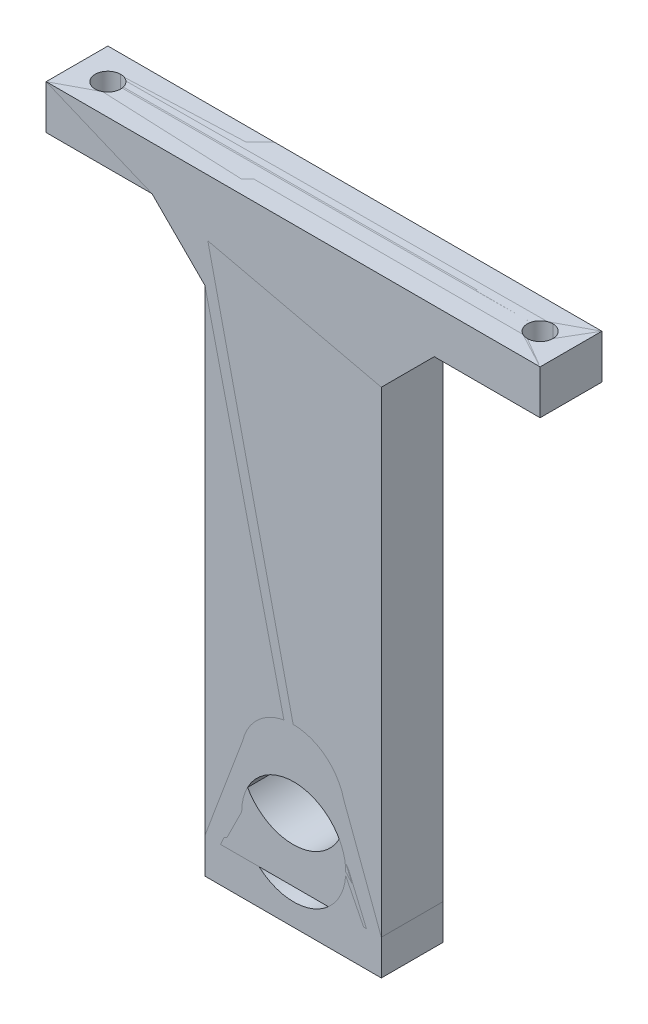
ISO-10303-21;
HEADER;
FILE_DESCRIPTION(('STEP AP214'),'2;1');
FILE_NAME('part.step','',(''),(''),'','','');
FILE_SCHEMA(('AUTOMOTIVE_DESIGN { 1 0 10303 214 1 1 1 1 }'));
ENDSEC;
DATA;
#1=APPLICATION_CONTEXT('core data for automotive mechanical design processes');
#2=APPLICATION_PROTOCOL_DEFINITION('international standard','automotive_design',2000,#1);
#3=PRODUCT_CONTEXT('',#1,'mechanical');
#4=PRODUCT('Part','Part','',(#3));
#5=PRODUCT_RELATED_PRODUCT_CATEGORY('part','',(#4));
#6=PRODUCT_DEFINITION_FORMATION('','',#4);
#7=PRODUCT_DEFINITION_CONTEXT('part definition',#1,'design');
#8=PRODUCT_DEFINITION('design','',#6,#7);
#9=PRODUCT_DEFINITION_SHAPE('','',#8);
#10=(LENGTH_UNIT() NAMED_UNIT(*) SI_UNIT(.MILLI.,.METRE.));
#11=(NAMED_UNIT(*) PLANE_ANGLE_UNIT() SI_UNIT($,.RADIAN.));
#12=(NAMED_UNIT(*) SI_UNIT($,.STERADIAN.) SOLID_ANGLE_UNIT());
#13=UNCERTAINTY_MEASURE_WITH_UNIT(LENGTH_MEASURE(1.E-05),#10,'distance_accuracy_value','');
#14=(GEOMETRIC_REPRESENTATION_CONTEXT(3) GLOBAL_UNCERTAINTY_ASSIGNED_CONTEXT((#13)) GLOBAL_UNIT_ASSIGNED_CONTEXT((#10,
#11,#12)) REPRESENTATION_CONTEXT('',''));
#15=CARTESIAN_POINT('',(0.,0.,0.));
#16=DIRECTION('',(0.,0.,1.));
#17=DIRECTION('',(1.,0.,0.));
#18=AXIS2_PLACEMENT_3D('',#15,#16,#17);
#19=CARTESIAN_POINT('',(10.,0.,24.));
#20=DIRECTION('',(1.,0.,0.));
#21=DIRECTION('',(0.,1.,0.));
#22=AXIS2_PLACEMENT_3D('',#19,#20,#21);
#23=PLANE('',#22);
#24=DIRECTION('',(0.,-1.,0.));
#25=VECTOR('',#24,1.);
#26=CARTESIAN_POINT('',(10.,-5.,24.));
#27=LINE('',#26,#25);
#28=CARTESIAN_POINT('',(10.,-11.,24.));
#29=VERTEX_POINT('',#28);
#30=CARTESIAN_POINT('',(10.,-69.,24.));
#31=VERTEX_POINT('',#30);
#32=EDGE_CURVE('P0_E223',#29,#31,#27,.T.);
#33=ORIENTED_EDGE('',*,*,#32,.F.);
#34=DIRECTION('',(0.,0.,1.));
#35=VECTOR('',#34,1.);
#36=CARTESIAN_POINT('',(10.,-11.,24.));
#37=LINE('',#36,#35);
#38=CARTESIAN_POINT('',(10.,-11.,31.));
#39=VERTEX_POINT('',#38);
#40=EDGE_CURVE('P0_E143',#29,#39,#37,.T.);
#41=ORIENTED_EDGE('',*,*,#40,.T.);
#42=DIRECTION('',(0.,-1.,0.));
#43=VECTOR('',#42,1.);
#44=CARTESIAN_POINT('',(10.,-5.,31.));
#45=LINE('',#44,#43);
#46=CARTESIAN_POINT('',(10.,-69.,31.));
#47=VERTEX_POINT('',#46);
#48=EDGE_CURVE('P0_E137',#39,#47,#45,.T.);
#49=ORIENTED_EDGE('',*,*,#48,.T.);
#50=DIRECTION('',(0.,0.,1.));
#51=VECTOR('',#50,1.);
#52=CARTESIAN_POINT('',(10.,-69.,24.));
#53=LINE('',#52,#51);
#54=EDGE_CURVE('P0_E141',#31,#47,#53,.T.);
#55=ORIENTED_EDGE('',*,*,#54,.F.);
#56=EDGE_LOOP('',(#33,#41,#49,#55));
#57=FACE_BOUND('',#56,.T.);
#58=ADVANCED_FACE('P0_F36',(#57),#23,.T.);
#59=CARTESIAN_POINT('',(0.,-5.,0.));
#60=DIRECTION('',(0.,1.,0.));
#61=DIRECTION('',(1.,0.,0.));
#62=AXIS2_PLACEMENT_3D('',#59,#60,#61);
#63=PLANE('',#62);
#64=DIRECTION('',(1.,0.,0.));
#65=VECTOR('',#64,1.);
#66=CARTESIAN_POINT('',(10.,-5.,31.));
#67=LINE('',#66,#65);
#68=CARTESIAN_POINT('',(16.,-5.,31.));
#69=VERTEX_POINT('',#68);
#70=CARTESIAN_POINT('',(28.,-5.,31.));
#71=VERTEX_POINT('',#70);
#72=EDGE_CURVE('P0_E190',#69,#71,#67,.T.);
#73=ORIENTED_EDGE('',*,*,#72,.F.);
#74=DIRECTION('',(0.,0.,-1.));
#75=VECTOR('',#74,1.);
#76=CARTESIAN_POINT('',(16.,-5.,0.));
#77=LINE('',#76,#75);
#78=CARTESIAN_POINT('',(16.,-5.,24.));
#79=VERTEX_POINT('',#78);
#80=EDGE_CURVE('P0_E58',#69,#79,#77,.T.);
#81=ORIENTED_EDGE('',*,*,#80,.T.);
#82=DIRECTION('',(-1.,0.,0.));
#83=VECTOR('',#82,1.);
#84=CARTESIAN_POINT('',(28.,-5.,24.));
#85=LINE('',#84,#83);
#86=CARTESIAN_POINT('',(28.,-5.,24.));
#87=VERTEX_POINT('',#86);
#88=EDGE_CURVE('P0_E200',#87,#79,#85,.T.);
#89=ORIENTED_EDGE('',*,*,#88,.F.);
#90=DIRECTION('',(0.,0.,-1.));
#91=VECTOR('',#90,1.);
#92=CARTESIAN_POINT('',(28.,-5.,31.));
#93=LINE('',#92,#91);
#94=EDGE_CURVE('P0_E221',#71,#87,#93,.T.);
#95=ORIENTED_EDGE('',*,*,#94,.F.);
#96=EDGE_LOOP('',(#73,#81,#89,#95));
#97=FACE_BOUND('',#96,.T.);
#98=CARTESIAN_POINT('',(24.5,-5.,27.5));
#99=DIRECTION('',(0.,-1.,0.));
#100=DIRECTION('',(0.,0.,1.));
#101=AXIS2_PLACEMENT_3D('',#98,#99,#100);
#102=CIRCLE('',#101,1.45);
#103=CARTESIAN_POINT('',(24.5,-5.,28.95));
#104=VERTEX_POINT('',#103);
#105=CARTESIAN_POINT('',(24.5,-5.,26.05));
#106=VERTEX_POINT('',#105);
#107=EDGE_CURVE('P0_E172',#104,#106,#102,.T.);
#108=ORIENTED_EDGE('',*,*,#107,.F.);
#109=CARTESIAN_POINT('',(24.5,-5.,27.5));
#110=DIRECTION('',(0.,-1.,0.));
#111=DIRECTION('',(0.,0.,-1.));
#112=AXIS2_PLACEMENT_3D('',#109,#110,#111);
#113=CIRCLE('',#112,1.45);
#114=EDGE_CURVE('P0_E196',#106,#104,#113,.T.);
#115=ORIENTED_EDGE('',*,*,#114,.F.);
#116=EDGE_LOOP('',(#108,#115));
#117=FACE_BOUND('',#116,.T.);
#118=ADVANCED_FACE('P0_F281',(#97,#117),#63,.F.);
#119=CARTESIAN_POINT('',(0.,-5.,0.));
#120=DIRECTION('',(0.,1.,0.));
#121=DIRECTION('',(1.,0.,0.));
#122=AXIS2_PLACEMENT_3D('',#119,#120,#121);
#123=PLANE('',#122);
#124=DIRECTION('',(-1.,0.,0.));
#125=VECTOR('',#124,1.);
#126=CARTESIAN_POINT('',(-10.,-5.,24.));
#127=LINE('',#126,#125);
#128=CARTESIAN_POINT('',(-16.,-5.,24.));
#129=VERTEX_POINT('',#128);
#130=CARTESIAN_POINT('',(-28.,-5.,24.));
#131=VERTEX_POINT('',#130);
#132=EDGE_CURVE('P0_E192',#129,#131,#127,.T.);
#133=ORIENTED_EDGE('',*,*,#132,.F.);
#134=DIRECTION('',(0.,0.,1.));
#135=VECTOR('',#134,1.);
#136=CARTESIAN_POINT('',(-16.,-5.,0.));
#137=LINE('',#136,#135);
#138=CARTESIAN_POINT('',(-16.,-5.,31.));
#139=VERTEX_POINT('',#138);
#140=EDGE_CURVE('P0_E244',#129,#139,#137,.T.);
#141=ORIENTED_EDGE('',*,*,#140,.T.);
#142=DIRECTION('',(1.,0.,0.));
#143=VECTOR('',#142,1.);
#144=CARTESIAN_POINT('',(-28.,-5.,31.));
#145=LINE('',#144,#143);
#146=CARTESIAN_POINT('',(-28.,-5.,31.));
#147=VERTEX_POINT('',#146);
#148=EDGE_CURVE('P0_E203',#147,#139,#145,.T.);
#149=ORIENTED_EDGE('',*,*,#148,.F.);
#150=DIRECTION('',(0.,0.,1.));
#151=VECTOR('',#150,1.);
#152=CARTESIAN_POINT('',(-28.,-5.,24.));
#153=LINE('',#152,#151);
#154=EDGE_CURVE('P0_E182',#131,#147,#153,.T.);
#155=ORIENTED_EDGE('',*,*,#154,.F.);
#156=EDGE_LOOP('',(#133,#141,#149,#155));
#157=FACE_BOUND('',#156,.T.);
#158=CARTESIAN_POINT('',(-24.5,-5.,27.5));
#159=DIRECTION('',(0.,-1.,0.));
#160=DIRECTION('',(0.,0.,1.));
#161=AXIS2_PLACEMENT_3D('',#158,#159,#160);
#162=CIRCLE('',#161,1.45);
#163=CARTESIAN_POINT('',(-24.5,-5.,28.95));
#164=VERTEX_POINT('',#163);
#165=CARTESIAN_POINT('',(-24.5,-5.,26.05));
#166=VERTEX_POINT('',#165);
#167=EDGE_CURVE('P0_E207',#164,#166,#162,.T.);
#168=ORIENTED_EDGE('',*,*,#167,.F.);
#169=CARTESIAN_POINT('',(-24.5,-5.,27.5));
#170=DIRECTION('',(0.,-1.,0.));
#171=DIRECTION('',(0.,0.,-1.));
#172=AXIS2_PLACEMENT_3D('',#169,#170,#171);
#173=CIRCLE('',#172,1.45);
#174=EDGE_CURVE('P0_E212',#166,#164,#173,.T.);
#175=ORIENTED_EDGE('',*,*,#174,.F.);
#176=EDGE_LOOP('',(#168,#175));
#177=FACE_BOUND('',#176,.T.);
#178=ADVANCED_FACE('P0_F266',(#157,#177),#123,.F.);
#179=CARTESIAN_POINT('',(-24.5,0.,27.5));
#180=DIRECTION('',(0.,1.,0.));
#181=DIRECTION('',(0.,0.,-1.));
#182=AXIS2_PLACEMENT_3D('',#179,#180,#181);
#183=CYLINDRICAL_SURFACE('',#182,1.45);
#184=DIRECTION('',(0.,-1.,0.));
#185=VECTOR('',#184,1.);
#186=CARTESIAN_POINT('',(-24.5,0.,26.05));
#187=LINE('',#186,#185);
#188=CARTESIAN_POINT('',(-24.5,0.,26.05));
#189=VERTEX_POINT('',#188);
#190=EDGE_CURVE('P0_E145',#189,#166,#187,.T.);
#191=ORIENTED_EDGE('',*,*,#190,.T.);
#192=ORIENTED_EDGE('',*,*,#174,.T.);
#193=DIRECTION('',(0.,-1.,0.));
#194=VECTOR('',#193,1.);
#195=CARTESIAN_POINT('',(-24.5,0.,28.95));
#196=LINE('',#195,#194);
#197=CARTESIAN_POINT('',(-24.5,0.,28.95));
#198=VERTEX_POINT('',#197);
#199=EDGE_CURVE('P0_E187',#198,#164,#196,.T.);
#200=ORIENTED_EDGE('',*,*,#199,.F.);
#201=CARTESIAN_POINT('',(-24.5,0.,27.5));
#202=DIRECTION('',(0.,-1.,0.));
#203=DIRECTION('',(0.,0.,-1.));
#204=AXIS2_PLACEMENT_3D('',#201,#202,#203);
#205=CIRCLE('',#204,1.45);
#206=EDGE_CURVE('P0_E183',#189,#198,#205,.T.);
#207=ORIENTED_EDGE('',*,*,#206,.F.);
#208=EDGE_LOOP('',(#191,#192,#200,#207));
#209=FACE_BOUND('',#208,.T.);
#210=ADVANCED_FACE('P0_F325',(#209),#183,.F.);
#211=CARTESIAN_POINT('',(0.,0.,0.));
#212=DIRECTION('',(0.,1.,0.));
#213=DIRECTION('',(1.,0.,0.));
#214=AXIS2_PLACEMENT_3D('',#211,#212,#213);
#215=PLANE('',#214);
#216=DIRECTION('',(1.,0.,0.));
#217=VECTOR('',#216,1.);
#218=CARTESIAN_POINT('',(-28.,0.,31.));
#219=LINE('',#218,#217);
#220=CARTESIAN_POINT('',(-28.,0.,31.));
#221=VERTEX_POINT('',#220);
#222=CARTESIAN_POINT('',(28.,0.,31.));
#223=VERTEX_POINT('',#222);
#224=EDGE_CURVE('P0_E179',#221,#223,#219,.T.);
#225=ORIENTED_EDGE('',*,*,#224,.T.);
#226=DIRECTION('',(0.,0.,-1.));
#227=VECTOR('',#226,1.);
#228=CARTESIAN_POINT('',(28.,0.,31.));
#229=LINE('',#228,#227);
#230=CARTESIAN_POINT('',(28.,0.,24.));
#231=VERTEX_POINT('',#230);
#232=EDGE_CURVE('P0_E209',#223,#231,#229,.T.);
#233=ORIENTED_EDGE('',*,*,#232,.T.);
#234=DIRECTION('',(-1.,0.,0.));
#235=VECTOR('',#234,1.);
#236=CARTESIAN_POINT('',(28.,0.,24.));
#237=LINE('',#236,#235);
#238=CARTESIAN_POINT('',(-28.,0.,24.));
#239=VERTEX_POINT('',#238);
#240=EDGE_CURVE('P0_E213',#231,#239,#237,.T.);
#241=ORIENTED_EDGE('',*,*,#240,.T.);
#242=DIRECTION('',(0.,0.,1.));
#243=VECTOR('',#242,1.);
#244=CARTESIAN_POINT('',(-28.,0.,24.));
#245=LINE('',#244,#243);
#246=EDGE_CURVE('P0_E228',#239,#221,#245,.T.);
#247=ORIENTED_EDGE('',*,*,#246,.T.);
#248=EDGE_LOOP('',(#225,#233,#241,#247));
#249=FACE_BOUND('',#248,.T.);
#250=CARTESIAN_POINT('',(-24.5,0.,27.5));
#251=DIRECTION('',(0.,-1.,0.));
#252=DIRECTION('',(0.,0.,1.));
#253=AXIS2_PLACEMENT_3D('',#250,#251,#252);
#254=CIRCLE('',#253,1.45);
#255=EDGE_CURVE('P0_E186',#198,#189,#254,.T.);
#256=ORIENTED_EDGE('',*,*,#255,.T.);
#257=ORIENTED_EDGE('',*,*,#206,.T.);
#258=EDGE_LOOP('',(#256,#257));
#259=FACE_BOUND('',#258,.T.);
#260=CARTESIAN_POINT('',(24.5,0.,27.5));
#261=DIRECTION('',(0.,-1.,0.));
#262=DIRECTION('',(0.,0.,1.));
#263=AXIS2_PLACEMENT_3D('',#260,#261,#262);
#264=CIRCLE('',#263,1.45);
#265=CARTESIAN_POINT('',(24.5,0.,28.95));
#266=VERTEX_POINT('',#265);
#267=CARTESIAN_POINT('',(24.5,0.,26.05));
#268=VERTEX_POINT('',#267);
#269=EDGE_CURVE('P0_E176',#266,#268,#264,.T.);
#270=ORIENTED_EDGE('',*,*,#269,.T.);
#271=CARTESIAN_POINT('',(24.5,0.,27.5));
#272=DIRECTION('',(0.,-1.,0.));
#273=DIRECTION('',(0.,0.,-1.));
#274=AXIS2_PLACEMENT_3D('',#271,#272,#273);
#275=CIRCLE('',#274,1.45);
#276=EDGE_CURVE('P0_E180',#268,#266,#275,.T.);
#277=ORIENTED_EDGE('',*,*,#276,.T.);
#278=EDGE_LOOP('',(#270,#277));
#279=FACE_BOUND('',#278,.T.);
#280=ADVANCED_FACE('P0_F275',(#249,#259,#279),#215,.T.);
#281=CARTESIAN_POINT('',(-24.5,0.,27.5));
#282=DIRECTION('',(0.,1.,0.));
#283=DIRECTION('',(0.,0.,-1.));
#284=AXIS2_PLACEMENT_3D('',#281,#282,#283);
#285=CYLINDRICAL_SURFACE('',#284,1.45);
#286=ORIENTED_EDGE('',*,*,#199,.T.);
#287=ORIENTED_EDGE('',*,*,#167,.T.);
#288=ORIENTED_EDGE('',*,*,#190,.F.);
#289=ORIENTED_EDGE('',*,*,#255,.F.);
#290=EDGE_LOOP('',(#286,#287,#288,#289));
#291=FACE_BOUND('',#290,.T.);
#292=ADVANCED_FACE('P0_F304',(#291),#285,.F.);
#293=CARTESIAN_POINT('',(24.5,0.,27.5));
#294=DIRECTION('',(0.,1.,0.));
#295=DIRECTION('',(0.,0.,-1.));
#296=AXIS2_PLACEMENT_3D('',#293,#294,#295);
#297=CYLINDRICAL_SURFACE('',#296,1.45);
#298=DIRECTION('',(0.,-1.,0.));
#299=VECTOR('',#298,1.);
#300=CARTESIAN_POINT('',(24.5,0.,26.05));
#301=LINE('',#300,#299);
#302=EDGE_CURVE('P0_E204',#268,#106,#301,.T.);
#303=ORIENTED_EDGE('',*,*,#302,.T.);
#304=ORIENTED_EDGE('',*,*,#114,.T.);
#305=DIRECTION('',(0.,-1.,0.));
#306=VECTOR('',#305,1.);
#307=CARTESIAN_POINT('',(24.5,0.,28.95));
#308=LINE('',#307,#306);
#309=EDGE_CURVE('P0_E174',#266,#104,#308,.T.);
#310=ORIENTED_EDGE('',*,*,#309,.F.);
#311=ORIENTED_EDGE('',*,*,#276,.F.);
#312=EDGE_LOOP('',(#303,#304,#310,#311));
#313=FACE_BOUND('',#312,.T.);
#314=ADVANCED_FACE('P0_F301',(#313),#297,.F.);
#315=CARTESIAN_POINT('',(24.5,0.,27.5));
#316=DIRECTION('',(0.,1.,0.));
#317=DIRECTION('',(0.,0.,-1.));
#318=AXIS2_PLACEMENT_3D('',#315,#316,#317);
#319=CYLINDRICAL_SURFACE('',#318,1.45);
#320=ORIENTED_EDGE('',*,*,#309,.T.);
#321=ORIENTED_EDGE('',*,*,#107,.T.);
#322=ORIENTED_EDGE('',*,*,#302,.F.);
#323=ORIENTED_EDGE('',*,*,#269,.F.);
#324=EDGE_LOOP('',(#320,#321,#322,#323));
#325=FACE_BOUND('',#324,.T.);
#326=ADVANCED_FACE('P0_F303',(#325),#319,.F.);
#327=CARTESIAN_POINT('',(10.,0.,31.));
#328=DIRECTION('',(0.,0.,1.));
#329=DIRECTION('',(1.,0.,0.));
#330=AXIS2_PLACEMENT_3D('',#327,#328,#329);
#331=PLANE('',#330);
#332=CARTESIAN_POINT('',(0.0675761844499759,-60.6,31.));
#333=DIRECTION('',(0.,0.,-1.));
#334=DIRECTION('',(-1.,0.,0.));
#335=AXIS2_PLACEMENT_3D('',#332,#333,#334);
#336=CIRCLE('',#335,5.9);
#337=CARTESIAN_POINT('',(-5.83242381555003,-60.6,31.));
#338=VERTEX_POINT('',#337);
#339=EDGE_CURVE('P0_E162',#338,#338,#336,.T.);
#340=ORIENTED_EDGE('',*,*,#339,.T.);
#341=EDGE_LOOP('',(#340));
#342=FACE_BOUND('',#341,.T.);
#343=ORIENTED_EDGE('',*,*,#148,.T.);
#344=DIRECTION('',(0.707106781186544,-0.707106781186551,0.));
#345=VECTOR('',#344,1.);
#346=CARTESIAN_POINT('',(-10.,-11.,31.));
#347=LINE('',#346,#345);
#348=CARTESIAN_POINT('',(-10.,-11.,31.));
#349=VERTEX_POINT('',#348);
#350=EDGE_CURVE('P0_E250',#139,#349,#347,.T.);
#351=ORIENTED_EDGE('',*,*,#350,.T.);
#352=DIRECTION('',(0.,-1.,0.));
#353=VECTOR('',#352,1.);
#354=CARTESIAN_POINT('',(-10.,-5.,31.));
#355=LINE('',#354,#353);
#356=CARTESIAN_POINT('',(-10.,-69.,31.));
#357=VERTEX_POINT('',#356);
#358=EDGE_CURVE('P0_E152',#349,#357,#355,.T.);
#359=ORIENTED_EDGE('',*,*,#358,.T.);
#360=DIRECTION('',(-1.,0.,0.));
#361=VECTOR('',#360,1.);
#362=CARTESIAN_POINT('',(10.,-69.,31.));
#363=LINE('',#362,#361);
#364=EDGE_CURVE('P0_E148',#47,#357,#363,.T.);
#365=ORIENTED_EDGE('',*,*,#364,.F.);
#366=ORIENTED_EDGE('',*,*,#48,.F.);
#367=DIRECTION('',(0.707106781186544,0.707106781186551,0.));
#368=VECTOR('',#367,1.);
#369=CARTESIAN_POINT('',(10.,-11.,31.));
#370=LINE('',#369,#368);
#371=EDGE_CURVE('P0_E45',#39,#69,#370,.T.);
#372=ORIENTED_EDGE('',*,*,#371,.T.);
#373=ORIENTED_EDGE('',*,*,#72,.T.);
#374=DIRECTION('',(0.,-1.,0.));
#375=VECTOR('',#374,1.);
#376=CARTESIAN_POINT('',(28.,0.,31.));
#377=LINE('',#376,#375);
#378=EDGE_CURVE('P0_E225',#223,#71,#377,.T.);
#379=ORIENTED_EDGE('',*,*,#378,.F.);
#380=ORIENTED_EDGE('',*,*,#224,.F.);
#381=DIRECTION('',(0.,-1.,0.));
#382=VECTOR('',#381,1.);
#383=CARTESIAN_POINT('',(-28.,0.,31.));
#384=LINE('',#383,#382);
#385=EDGE_CURVE('P0_E175',#221,#147,#384,.T.);
#386=ORIENTED_EDGE('',*,*,#385,.T.);
#387=EDGE_LOOP('',(#343,#351,#359,#365,#366,#372,#373,#379,#380,#386));
#388=FACE_BOUND('',#387,.T.);
#389=ADVANCED_FACE('P0_F150',(#342,#388),#331,.T.);
#390=CARTESIAN_POINT('',(-10.,0.,24.));
#391=DIRECTION('',(0.,0.,-1.));
#392=DIRECTION('',(0.,-1.,0.));
#393=AXIS2_PLACEMENT_3D('',#390,#391,#392);
#394=PLANE('',#393);
#395=CARTESIAN_POINT('',(0.0675761844499759,-60.6,24.));
#396=DIRECTION('',(0.,0.,-1.));
#397=DIRECTION('',(-1.,0.,0.));
#398=AXIS2_PLACEMENT_3D('',#395,#396,#397);
#399=CIRCLE('',#398,5.9);
#400=CARTESIAN_POINT('',(-5.83242381555003,-60.6,24.));
#401=VERTEX_POINT('',#400);
#402=EDGE_CURVE('P0_E165',#401,#401,#399,.T.);
#403=ORIENTED_EDGE('',*,*,#402,.F.);
#404=EDGE_LOOP('',(#403));
#405=FACE_BOUND('',#404,.T.);
#406=DIRECTION('',(0.,-1.,0.));
#407=VECTOR('',#406,1.);
#408=CARTESIAN_POINT('',(-28.,0.,24.));
#409=LINE('',#408,#407);
#410=EDGE_CURVE('P0_E216',#239,#131,#409,.T.);
#411=ORIENTED_EDGE('',*,*,#410,.F.);
#412=ORIENTED_EDGE('',*,*,#240,.F.);
#413=DIRECTION('',(0.,-1.,0.));
#414=VECTOR('',#413,1.);
#415=CARTESIAN_POINT('',(28.,0.,24.));
#416=LINE('',#415,#414);
#417=EDGE_CURVE('P0_E197',#231,#87,#416,.T.);
#418=ORIENTED_EDGE('',*,*,#417,.T.);
#419=ORIENTED_EDGE('',*,*,#88,.T.);
#420=DIRECTION('',(-0.707106781186544,-0.707106781186551,0.));
#421=VECTOR('',#420,1.);
#422=CARTESIAN_POINT('',(10.,-11.,24.));
#423=LINE('',#422,#421);
#424=EDGE_CURVE('P0_E11',#79,#29,#423,.T.);
#425=ORIENTED_EDGE('',*,*,#424,.T.);
#426=ORIENTED_EDGE('',*,*,#32,.T.);
#427=DIRECTION('',(1.,0.,0.));
#428=VECTOR('',#427,1.);
#429=CARTESIAN_POINT('',(-10.,-69.,24.));
#430=LINE('',#429,#428);
#431=CARTESIAN_POINT('',(-10.,-69.,24.));
#432=VERTEX_POINT('',#431);
#433=EDGE_CURVE('P0_E161',#432,#31,#430,.T.);
#434=ORIENTED_EDGE('',*,*,#433,.F.);
#435=DIRECTION('',(0.,-1.,0.));
#436=VECTOR('',#435,1.);
#437=CARTESIAN_POINT('',(-10.,-5.,24.));
#438=LINE('',#437,#436);
#439=CARTESIAN_POINT('',(-10.,-11.,24.));
#440=VERTEX_POINT('',#439);
#441=EDGE_CURVE('P0_E171',#440,#432,#438,.T.);
#442=ORIENTED_EDGE('',*,*,#441,.F.);
#443=DIRECTION('',(-0.707106781186544,0.707106781186551,0.));
#444=VECTOR('',#443,1.);
#445=CARTESIAN_POINT('',(-10.,-11.,24.));
#446=LINE('',#445,#444);
#447=EDGE_CURVE('P0_E248',#440,#129,#446,.T.);
#448=ORIENTED_EDGE('',*,*,#447,.T.);
#449=ORIENTED_EDGE('',*,*,#132,.T.);
#450=EDGE_LOOP('',(#411,#412,#418,#419,#425,#426,#434,#442,#448,#449));
#451=FACE_BOUND('',#450,.T.);
#452=ADVANCED_FACE('P0_F263',(#405,#451),#394,.T.);
#453=CARTESIAN_POINT('',(28.,0.,31.));
#454=DIRECTION('',(1.,0.,0.));
#455=DIRECTION('',(0.,1.,0.));
#456=AXIS2_PLACEMENT_3D('',#453,#454,#455);
#457=PLANE('',#456);
#458=ORIENTED_EDGE('',*,*,#378,.T.);
#459=ORIENTED_EDGE('',*,*,#94,.T.);
#460=ORIENTED_EDGE('',*,*,#417,.F.);
#461=ORIENTED_EDGE('',*,*,#232,.F.);
#462=EDGE_LOOP('',(#458,#459,#460,#461));
#463=FACE_BOUND('',#462,.T.);
#464=ADVANCED_FACE('P0_F279',(#463),#457,.T.);
#465=CARTESIAN_POINT('',(-28.,0.,24.));
#466=DIRECTION('',(-1.,0.,0.));
#467=DIRECTION('',(0.,0.,1.));
#468=AXIS2_PLACEMENT_3D('',#465,#466,#467);
#469=PLANE('',#468);
#470=ORIENTED_EDGE('',*,*,#410,.T.);
#471=ORIENTED_EDGE('',*,*,#154,.T.);
#472=ORIENTED_EDGE('',*,*,#385,.F.);
#473=ORIENTED_EDGE('',*,*,#246,.F.);
#474=EDGE_LOOP('',(#470,#471,#472,#473));
#475=FACE_BOUND('',#474,.T.);
#476=ADVANCED_FACE('P0_F271',(#475),#469,.T.);
#477=CARTESIAN_POINT('',(-10.,0.,31.));
#478=DIRECTION('',(-1.,0.,0.));
#479=DIRECTION('',(0.,0.,1.));
#480=AXIS2_PLACEMENT_3D('',#477,#478,#479);
#481=PLANE('',#480);
#482=ORIENTED_EDGE('',*,*,#358,.F.);
#483=DIRECTION('',(0.,0.,-1.));
#484=VECTOR('',#483,1.);
#485=CARTESIAN_POINT('',(-10.,-11.,31.));
#486=LINE('',#485,#484);
#487=EDGE_CURVE('P0_E144',#349,#440,#486,.T.);
#488=ORIENTED_EDGE('',*,*,#487,.T.);
#489=ORIENTED_EDGE('',*,*,#441,.T.);
#490=DIRECTION('',(0.,0.,-1.));
#491=VECTOR('',#490,1.);
#492=CARTESIAN_POINT('',(-10.,-69.,31.));
#493=LINE('',#492,#491);
#494=EDGE_CURVE('P0_E156',#357,#432,#493,.T.);
#495=ORIENTED_EDGE('',*,*,#494,.F.);
#496=EDGE_LOOP('',(#482,#488,#489,#495));
#497=FACE_BOUND('',#496,.T.);
#498=ADVANCED_FACE('P0_F257',(#497),#481,.T.);
#499=CARTESIAN_POINT('',(0.,-69.,0.));
#500=DIRECTION('',(0.,-1.,0.));
#501=DIRECTION('',(0.,0.,-1.));
#502=AXIS2_PLACEMENT_3D('',#499,#500,#501);
#503=PLANE('',#502);
#504=ORIENTED_EDGE('',*,*,#54,.T.);
#505=ORIENTED_EDGE('',*,*,#364,.T.);
#506=ORIENTED_EDGE('',*,*,#494,.T.);
#507=ORIENTED_EDGE('',*,*,#433,.T.);
#508=EDGE_LOOP('',(#504,#505,#506,#507));
#509=FACE_BOUND('',#508,.T.);
#510=ADVANCED_FACE('P0_F159',(#509),#503,.T.);
#511=CARTESIAN_POINT('',(0.0675761844499759,-60.6,31.));
#512=DIRECTION('',(0.,0.,-1.));
#513=DIRECTION('',(-1.,0.,0.));
#514=AXIS2_PLACEMENT_3D('',#511,#512,#513);
#515=CYLINDRICAL_SURFACE('',#514,5.9);
#516=CARTESIAN_POINT('',(-5.83242381555003,-60.6,31.));
#517=CARTESIAN_POINT('',(-5.83242381555003,-60.6,30.9270833333333));
#518=CARTESIAN_POINT('',(-5.83242381555003,-60.6,30.8541666666667));
#519=CARTESIAN_POINT('',(-5.83242381555003,-60.6,30.7083333333333));
#520=CARTESIAN_POINT('',(-5.83242381555003,-60.6,30.6354166666667));
#521=CARTESIAN_POINT('',(-5.83242381555003,-60.6,30.4895833333333));
#522=CARTESIAN_POINT('',(-5.83242381555003,-60.6,30.4166666666667));
#523=CARTESIAN_POINT('',(-5.83242381555003,-60.6,30.2708333333333));
#524=CARTESIAN_POINT('',(-5.83242381555003,-60.6,30.1979166666667));
#525=CARTESIAN_POINT('',(-5.83242381555003,-60.6,30.0520833333333));
#526=CARTESIAN_POINT('',(-5.83242381555003,-60.6,29.9791666666667));
#527=CARTESIAN_POINT('',(-5.83242381555003,-60.6,29.8333333333333));
#528=CARTESIAN_POINT('',(-5.83242381555003,-60.6,29.7604166666667));
#529=CARTESIAN_POINT('',(-5.83242381555003,-60.6,29.6145833333333));
#530=CARTESIAN_POINT('',(-5.83242381555003,-60.6,29.5416666666667));
#531=CARTESIAN_POINT('',(-5.83242381555003,-60.6,29.3958333333333));
#532=CARTESIAN_POINT('',(-5.83242381555003,-60.6,29.3229166666667));
#533=CARTESIAN_POINT('',(-5.83242381555003,-60.6,29.1770833333333));
#534=CARTESIAN_POINT('',(-5.83242381555003,-60.6,29.1041666666667));
#535=CARTESIAN_POINT('',(-5.83242381555003,-60.6,28.9583333333333));
#536=CARTESIAN_POINT('',(-5.83242381555003,-60.6,28.8854166666667));
#537=CARTESIAN_POINT('',(-5.83242381555003,-60.6,28.7395833333333));
#538=CARTESIAN_POINT('',(-5.83242381555003,-60.6,28.6666666666667));
#539=CARTESIAN_POINT('',(-5.83242381555003,-60.6,28.5208333333333));
#540=CARTESIAN_POINT('',(-5.83242381555003,-60.6,28.4479166666667));
#541=CARTESIAN_POINT('',(-5.83242381555003,-60.6,28.3020833333333));
#542=CARTESIAN_POINT('',(-5.83242381555003,-60.6,28.2291666666667));
#543=CARTESIAN_POINT('',(-5.83242381555003,-60.6,28.0833333333333));
#544=CARTESIAN_POINT('',(-5.83242381555003,-60.6,28.0104166666667));
#545=CARTESIAN_POINT('',(-5.83242381555003,-60.6,27.8645833333333));
#546=CARTESIAN_POINT('',(-5.83242381555003,-60.6,27.7916666666667));
#547=CARTESIAN_POINT('',(-5.83242381555003,-60.6,27.6458333333333));
#548=CARTESIAN_POINT('',(-5.83242381555003,-60.6,27.5729166666667));
#549=CARTESIAN_POINT('',(-5.83242381555003,-60.6,27.4270833333333));
#550=CARTESIAN_POINT('',(-5.83242381555003,-60.6,27.3541666666667));
#551=CARTESIAN_POINT('',(-5.83242381555003,-60.6,27.2083333333333));
#552=CARTESIAN_POINT('',(-5.83242381555003,-60.6,27.1354166666667));
#553=CARTESIAN_POINT('',(-5.83242381555003,-60.6,26.9895833333333));
#554=CARTESIAN_POINT('',(-5.83242381555003,-60.6,26.9166666666667));
#555=CARTESIAN_POINT('',(-5.83242381555003,-60.6,26.7708333333333));
#556=CARTESIAN_POINT('',(-5.83242381555003,-60.6,26.6979166666667));
#557=CARTESIAN_POINT('',(-5.83242381555003,-60.6,26.5520833333333));
#558=CARTESIAN_POINT('',(-5.83242381555003,-60.6,26.4791666666667));
#559=CARTESIAN_POINT('',(-5.83242381555003,-60.6,26.3333333333333));
#560=CARTESIAN_POINT('',(-5.83242381555003,-60.6,26.2604166666667));
#561=CARTESIAN_POINT('',(-5.83242381555003,-60.6,26.1145833333333));
#562=CARTESIAN_POINT('',(-5.83242381555003,-60.6,26.0416666666667));
#563=CARTESIAN_POINT('',(-5.83242381555003,-60.6,25.8958333333333));
#564=CARTESIAN_POINT('',(-5.83242381555003,-60.6,25.8229166666667));
#565=CARTESIAN_POINT('',(-5.83242381555003,-60.6,25.6770833333333));
#566=CARTESIAN_POINT('',(-5.83242381555003,-60.6,25.6041666666667));
#567=CARTESIAN_POINT('',(-5.83242381555003,-60.6,25.4583333333333));
#568=CARTESIAN_POINT('',(-5.83242381555003,-60.6,25.3854166666667));
#569=CARTESIAN_POINT('',(-5.83242381555003,-60.6,25.2395833333333));
#570=CARTESIAN_POINT('',(-5.83242381555003,-60.6,25.1666666666667));
#571=CARTESIAN_POINT('',(-5.83242381555003,-60.6,25.0208333333333));
#572=CARTESIAN_POINT('',(-5.83242381555003,-60.6,24.9479166666667));
#573=CARTESIAN_POINT('',(-5.83242381555003,-60.6,24.8020833333333));
#574=CARTESIAN_POINT('',(-5.83242381555003,-60.6,24.7291666666667));
#575=CARTESIAN_POINT('',(-5.83242381555003,-60.6,24.5833333333333));
#576=CARTESIAN_POINT('',(-5.83242381555003,-60.6,24.5104166666667));
#577=CARTESIAN_POINT('',(-5.83242381555003,-60.6,24.3645833333333));
#578=CARTESIAN_POINT('',(-5.83242381555003,-60.6,24.2916666666667));
#579=CARTESIAN_POINT('',(-5.83242381555003,-60.6,24.1458333333333));
#580=CARTESIAN_POINT('',(-5.83242381555003,-60.6,24.0729166666667));
#581=CARTESIAN_POINT('',(-5.83242381555003,-60.6,24.));
#582=B_SPLINE_CURVE_WITH_KNOTS('',3,(#516,#517,#518,#519,#520,#521,#522,#523,#524,#525,#526,
#527,#528,#529,#530,#531,#532,#533,#534,#535,#536,#537,#538,#539,#540,#541,#542,#543,#544,#545,
#546,#547,#548,#549,#550,#551,#552,#553,#554,#555,#556,#557,#558,#559,#560,#561,#562,#563,#564,
#565,#566,#567,#568,#569,#570,#571,#572,#573,#574,#575,#576,#577,#578,#579,#580,#581),
.UNSPECIFIED.,.F.,.F.,(4,2,2,2,2,2,2,2,2,2,2,2,2,2,2,2,2,2,2,2,2,2,2,2,2,2,2,2,2,2,2,2,4),(0.,
0.21875,0.4375,0.656250000000001,0.875000000000001,1.09375,1.3125,1.53125,1.75,1.96875,2.1875,
2.40625,2.625,2.84375,3.0625,3.28125,3.5,3.71875,3.9375,4.15625,4.375,4.59375,4.8125,5.03125,
5.25,5.46875,5.6875,5.90625,6.125,6.34375,6.5625,6.78125,7.),.UNSPECIFIED.);
#583=EDGE_CURVE('P0_BSEAM289',#338,#401,#582,.T.);
#584=ORIENTED_EDGE('',*,*,#339,.F.);
#585=ORIENTED_EDGE('',*,*,#402,.T.);
#586=ORIENTED_EDGE('',*,*,#583,.T.);
#587=ORIENTED_EDGE('',*,*,#583,.F.);
#588=EDGE_LOOP('',(#584,#586,#585,#587));
#589=FACE_BOUND('',#588,.T.);
#590=ADVANCED_FACE('P0_F289',(#589),#515,.F.);
#591=CARTESIAN_POINT('',(-10.,-11.,31.));
#592=DIRECTION('',(0.707106781186551,0.707106781186544,0.));
#593=DIRECTION('',(0.,0.,-1.));
#594=AXIS2_PLACEMENT_3D('',#591,#592,#593);
#595=PLANE('',#594);
#596=ORIENTED_EDGE('',*,*,#350,.F.);
#597=ORIENTED_EDGE('',*,*,#140,.F.);
#598=ORIENTED_EDGE('',*,*,#447,.F.);
#599=ORIENTED_EDGE('',*,*,#487,.F.);
#600=EDGE_LOOP('',(#596,#597,#598,#599));
#601=FACE_BOUND('',#600,.T.);
#602=ADVANCED_FACE('P0_F259',(#601),#595,.F.);
#603=CARTESIAN_POINT('',(10.,-11.,24.));
#604=DIRECTION('',(-0.707106781186551,0.707106781186544,0.));
#605=DIRECTION('',(0.,0.,1.));
#606=AXIS2_PLACEMENT_3D('',#603,#604,#605);
#607=PLANE('',#606);
#608=ORIENTED_EDGE('',*,*,#424,.F.);
#609=ORIENTED_EDGE('',*,*,#80,.F.);
#610=ORIENTED_EDGE('',*,*,#371,.F.);
#611=ORIENTED_EDGE('',*,*,#40,.F.);
#612=EDGE_LOOP('',(#608,#609,#610,#611));
#613=FACE_BOUND('',#612,.T.);
#614=ADVANCED_FACE('P0_F39',(#613),#607,.F.);
#615=CLOSED_SHELL('',(#58,#118,#178,#210,#280,#292,#314,#326,#389,#452,#464,#476,#498,#510,#590,
#602,#614));
#616=MANIFOLD_SOLID_BREP('P0_B2',#615);
#617=CARTESIAN_POINT('',(0.,-65.,0.));
#618=DIRECTION('',(0.,-1.,0.));
#619=DIRECTION('',(0.,0.,-1.));
#620=AXIS2_PLACEMENT_3D('',#617,#618,#619);
#621=PLANE('',#620);
#622=DIRECTION('',(-1.,0.,0.));
#623=VECTOR('',#622,1.);
#624=CARTESIAN_POINT('',(10.,-65.,31.));
#625=LINE('',#624,#623);
#626=CARTESIAN_POINT('',(10.,-65.,31.));
#627=VERTEX_POINT('',#626);
#628=CARTESIAN_POINT('',(-10.,-65.,31.));
#629=VERTEX_POINT('',#628);
#630=EDGE_CURVE('P1_E11',#627,#629,#625,.T.);
#631=ORIENTED_EDGE('',*,*,#630,.T.);
#632=DIRECTION('',(0.,0.,-1.));
#633=VECTOR('',#632,1.);
#634=CARTESIAN_POINT('',(-10.,-65.,31.));
#635=LINE('',#634,#633);
#636=CARTESIAN_POINT('',(-10.,-65.,24.));
#637=VERTEX_POINT('',#636);
#638=EDGE_CURVE('P1_E27',#629,#637,#635,.T.);
#639=ORIENTED_EDGE('',*,*,#638,.T.);
#640=DIRECTION('',(1.,0.,0.));
#641=VECTOR('',#640,1.);
#642=CARTESIAN_POINT('',(-10.,-65.,24.));
#643=LINE('',#642,#641);
#644=CARTESIAN_POINT('',(10.,-65.,24.));
#645=VERTEX_POINT('',#644);
#646=EDGE_CURVE('P1_E166',#637,#645,#643,.T.);
#647=ORIENTED_EDGE('',*,*,#646,.T.);
#648=DIRECTION('',(0.,0.,1.));
#649=VECTOR('',#648,1.);
#650=CARTESIAN_POINT('',(10.,-65.,24.));
#651=LINE('',#650,#649);
#652=EDGE_CURVE('P1_E155',#645,#627,#651,.T.);
#653=ORIENTED_EDGE('',*,*,#652,.T.);
#654=EDGE_LOOP('',(#631,#639,#647,#653));
#655=FACE_BOUND('',#654,.T.);
#656=ADVANCED_FACE('P1_F16',(#655),#621,.T.);
#657=CARTESIAN_POINT('',(10.,0.,24.));
#658=DIRECTION('',(1.,0.,0.));
#659=DIRECTION('',(0.,1.,0.));
#660=AXIS2_PLACEMENT_3D('',#657,#658,#659);
#661=PLANE('',#660);
#662=DIRECTION('',(0.,-1.,0.));
#663=VECTOR('',#662,1.);
#664=CARTESIAN_POINT('',(10.,-5.,31.));
#665=LINE('',#664,#663);
#666=CARTESIAN_POINT('',(10.,-5.,31.));
#667=VERTEX_POINT('',#666);
#668=EDGE_CURVE('P1_E162',#667,#627,#665,.T.);
#669=ORIENTED_EDGE('',*,*,#668,.T.);
#670=ORIENTED_EDGE('',*,*,#652,.F.);
#671=DIRECTION('',(0.,-1.,0.));
#672=VECTOR('',#671,1.);
#673=CARTESIAN_POINT('',(10.,-5.,24.));
#674=LINE('',#673,#672);
#675=CARTESIAN_POINT('',(10.,-5.,24.));
#676=VERTEX_POINT('',#675);
#677=EDGE_CURVE('P1_E159',#676,#645,#674,.T.);
#678=ORIENTED_EDGE('',*,*,#677,.F.);
#679=DIRECTION('',(0.,0.,1.));
#680=VECTOR('',#679,1.);
#681=CARTESIAN_POINT('',(10.,-5.,24.));
#682=LINE('',#681,#680);
#683=EDGE_CURVE('P1_E240',#676,#667,#682,.T.);
#684=ORIENTED_EDGE('',*,*,#683,.T.);
#685=EDGE_LOOP('',(#669,#670,#678,#684));
#686=FACE_BOUND('',#685,.T.);
#687=ADVANCED_FACE('P1_F157',(#686),#661,.T.);
#688=CARTESIAN_POINT('',(0.,-5.,0.));
#689=DIRECTION('',(0.,1.,0.));
#690=DIRECTION('',(1.,0.,0.));
#691=AXIS2_PLACEMENT_3D('',#688,#689,#690);
#692=PLANE('',#691);
#693=ORIENTED_EDGE('',*,*,#683,.F.);
#694=DIRECTION('',(-1.,0.,0.));
#695=VECTOR('',#694,1.);
#696=CARTESIAN_POINT('',(28.,-5.,24.));
#697=LINE('',#696,#695);
#698=CARTESIAN_POINT('',(28.,-5.,24.));
#699=VERTEX_POINT('',#698);
#700=EDGE_CURVE('P1_E177',#699,#676,#697,.T.);
#701=ORIENTED_EDGE('',*,*,#700,.F.);
#702=DIRECTION('',(0.,0.,-1.));
#703=VECTOR('',#702,1.);
#704=CARTESIAN_POINT('',(28.,-5.,31.));
#705=LINE('',#704,#703);
#706=CARTESIAN_POINT('',(28.,-5.,31.));
#707=VERTEX_POINT('',#706);
#708=EDGE_CURVE('P1_E192',#707,#699,#705,.T.);
#709=ORIENTED_EDGE('',*,*,#708,.F.);
#710=DIRECTION('',(1.,0.,0.));
#711=VECTOR('',#710,1.);
#712=CARTESIAN_POINT('',(10.,-5.,31.));
#713=LINE('',#712,#711);
#714=EDGE_CURVE('P1_E216',#667,#707,#713,.T.);
#715=ORIENTED_EDGE('',*,*,#714,.F.);
#716=EDGE_LOOP('',(#693,#701,#709,#715));
#717=FACE_BOUND('',#716,.T.);
#718=CARTESIAN_POINT('',(24.5,-5.,27.5));
#719=DIRECTION('',(0.,-1.,0.));
#720=DIRECTION('',(0.,0.,1.));
#721=AXIS2_PLACEMENT_3D('',#718,#719,#720);
#722=CIRCLE('',#721,1.45);
#723=CARTESIAN_POINT('',(24.5,-5.,28.95));
#724=VERTEX_POINT('',#723);
#725=CARTESIAN_POINT('',(24.5,-5.,26.05));
#726=VERTEX_POINT('',#725);
#727=EDGE_CURVE('P1_E85',#724,#726,#722,.T.);
#728=ORIENTED_EDGE('',*,*,#727,.F.);
#729=CARTESIAN_POINT('',(24.5,-5.,27.5));
#730=DIRECTION('',(0.,-1.,0.));
#731=DIRECTION('',(0.,0.,-1.));
#732=AXIS2_PLACEMENT_3D('',#729,#730,#731);
#733=CIRCLE('',#732,1.45);
#734=EDGE_CURVE('P1_E227',#726,#724,#733,.T.);
#735=ORIENTED_EDGE('',*,*,#734,.F.);
#736=EDGE_LOOP('',(#728,#735));
#737=FACE_BOUND('',#736,.T.);
#738=ADVANCED_FACE('P1_F342',(#717,#737),#692,.F.);
#739=CARTESIAN_POINT('',(0.,-5.,0.));
#740=DIRECTION('',(0.,1.,0.));
#741=DIRECTION('',(1.,0.,0.));
#742=AXIS2_PLACEMENT_3D('',#739,#740,#741);
#743=PLANE('',#742);
#744=DIRECTION('',(0.,0.,-1.));
#745=VECTOR('',#744,1.);
#746=CARTESIAN_POINT('',(-10.,-5.,31.));
#747=LINE('',#746,#745);
#748=CARTESIAN_POINT('',(-10.,-5.,31.));
#749=VERTEX_POINT('',#748);
#750=CARTESIAN_POINT('',(-10.,-5.,24.));
#751=VERTEX_POINT('',#750);
#752=EDGE_CURVE('P1_E72',#749,#751,#747,.T.);
#753=ORIENTED_EDGE('',*,*,#752,.F.);
#754=DIRECTION('',(1.,0.,0.));
#755=VECTOR('',#754,1.);
#756=CARTESIAN_POINT('',(-28.,-5.,31.));
#757=LINE('',#756,#755);
#758=CARTESIAN_POINT('',(-28.,-5.,31.));
#759=VERTEX_POINT('',#758);
#760=EDGE_CURVE('P1_E215',#759,#749,#757,.T.);
#761=ORIENTED_EDGE('',*,*,#760,.F.);
#762=DIRECTION('',(0.,0.,1.));
#763=VECTOR('',#762,1.);
#764=CARTESIAN_POINT('',(-28.,-5.,24.));
#765=LINE('',#764,#763);
#766=CARTESIAN_POINT('',(-28.,-5.,24.));
#767=VERTEX_POINT('',#766);
#768=EDGE_CURVE('P1_E268',#767,#759,#765,.T.);
#769=ORIENTED_EDGE('',*,*,#768,.F.);
#770=DIRECTION('',(-1.,0.,0.));
#771=VECTOR('',#770,1.);
#772=CARTESIAN_POINT('',(-10.,-5.,24.));
#773=LINE('',#772,#771);
#774=EDGE_CURVE('P1_E233',#751,#767,#773,.T.);
#775=ORIENTED_EDGE('',*,*,#774,.F.);
#776=EDGE_LOOP('',(#753,#761,#769,#775));
#777=FACE_BOUND('',#776,.T.);
#778=CARTESIAN_POINT('',(-24.5,-5.,27.5));
#779=DIRECTION('',(0.,-1.,0.));
#780=DIRECTION('',(0.,0.,1.));
#781=AXIS2_PLACEMENT_3D('',#778,#779,#780);
#782=CIRCLE('',#781,1.45);
#783=CARTESIAN_POINT('',(-24.5,-5.,28.95));
#784=VERTEX_POINT('',#783);
#785=CARTESIAN_POINT('',(-24.5,-5.,26.05));
#786=VERTEX_POINT('',#785);
#787=EDGE_CURVE('P1_E297',#784,#786,#782,.T.);
#788=ORIENTED_EDGE('',*,*,#787,.F.);
#789=CARTESIAN_POINT('',(-24.5,-5.,27.5));
#790=DIRECTION('',(0.,-1.,0.));
#791=DIRECTION('',(0.,0.,-1.));
#792=AXIS2_PLACEMENT_3D('',#789,#790,#791);
#793=CIRCLE('',#792,1.45);
#794=EDGE_CURVE('P1_E222',#786,#784,#793,.T.);
#795=ORIENTED_EDGE('',*,*,#794,.F.);
#796=EDGE_LOOP('',(#788,#795));
#797=FACE_BOUND('',#796,.T.);
#798=ADVANCED_FACE('P1_F322',(#777,#797),#743,.F.);
#799=CARTESIAN_POINT('',(-24.5,0.,27.5));
#800=DIRECTION('',(0.,1.,0.));
#801=DIRECTION('',(0.,0.,-1.));
#802=AXIS2_PLACEMENT_3D('',#799,#800,#801);
#803=CYLINDRICAL_SURFACE('',#802,1.45);
#804=DIRECTION('',(0.,-1.,0.));
#805=VECTOR('',#804,1.);
#806=CARTESIAN_POINT('',(-24.5,0.,26.05));
#807=LINE('',#806,#805);
#808=CARTESIAN_POINT('',(-24.5,0.,26.05));
#809=VERTEX_POINT('',#808);
#810=EDGE_CURVE('P1_E226',#809,#786,#807,.T.);
#811=ORIENTED_EDGE('',*,*,#810,.T.);
#812=ORIENTED_EDGE('',*,*,#794,.T.);
#813=DIRECTION('',(0.,-1.,0.));
#814=VECTOR('',#813,1.);
#815=CARTESIAN_POINT('',(-24.5,0.,28.95));
#816=LINE('',#815,#814);
#817=CARTESIAN_POINT('',(-24.5,0.,28.95));
#818=VERTEX_POINT('',#817);
#819=EDGE_CURVE('P1_E274',#818,#784,#816,.T.);
#820=ORIENTED_EDGE('',*,*,#819,.F.);
#821=CARTESIAN_POINT('',(-24.5,0.,27.5));
#822=DIRECTION('',(0.,-1.,0.));
#823=DIRECTION('',(0.,0.,-1.));
#824=AXIS2_PLACEMENT_3D('',#821,#822,#823);
#825=CIRCLE('',#824,1.45);
#826=EDGE_CURVE('P1_E269',#809,#818,#825,.T.);
#827=ORIENTED_EDGE('',*,*,#826,.F.);
#828=EDGE_LOOP('',(#811,#812,#820,#827));
#829=FACE_BOUND('',#828,.T.);
#830=ADVANCED_FACE('P1_F355',(#829),#803,.F.);
#831=CARTESIAN_POINT('',(0.,0.,0.));
#832=DIRECTION('',(0.,1.,0.));
#833=DIRECTION('',(1.,0.,0.));
#834=AXIS2_PLACEMENT_3D('',#831,#832,#833);
#835=PLANE('',#834);
#836=DIRECTION('',(0.,0.,-1.));
#837=VECTOR('',#836,1.);
#838=CARTESIAN_POINT('',(28.,0.,31.));
#839=LINE('',#838,#837);
#840=CARTESIAN_POINT('',(28.,0.,31.));
#841=VERTEX_POINT('',#840);
#842=CARTESIAN_POINT('',(28.,0.,24.));
#843=VERTEX_POINT('',#842);
#844=EDGE_CURVE('P1_E207',#841,#843,#839,.T.);
#845=ORIENTED_EDGE('',*,*,#844,.T.);
#846=DIRECTION('',(-1.,0.,0.));
#847=VECTOR('',#846,1.);
#848=CARTESIAN_POINT('',(28.,0.,24.));
#849=LINE('',#848,#847);
#850=CARTESIAN_POINT('',(-28.,0.,24.));
#851=VERTEX_POINT('',#850);
#852=EDGE_CURVE('P1_E203',#843,#851,#849,.T.);
#853=ORIENTED_EDGE('',*,*,#852,.T.);
#854=DIRECTION('',(0.,0.,1.));
#855=VECTOR('',#854,1.);
#856=CARTESIAN_POINT('',(-28.,0.,24.));
#857=LINE('',#856,#855);
#858=CARTESIAN_POINT('',(-28.,0.,31.));
#859=VERTEX_POINT('',#858);
#860=EDGE_CURVE('P1_E201',#851,#859,#857,.T.);
#861=ORIENTED_EDGE('',*,*,#860,.T.);
#862=DIRECTION('',(1.,0.,0.));
#863=VECTOR('',#862,1.);
#864=CARTESIAN_POINT('',(-28.,0.,31.));
#865=LINE('',#864,#863);
#866=EDGE_CURVE('P1_E198',#859,#841,#865,.T.);
#867=ORIENTED_EDGE('',*,*,#866,.T.);
#868=EDGE_LOOP('',(#845,#853,#861,#867));
#869=FACE_BOUND('',#868,.T.);
#870=CARTESIAN_POINT('',(24.5,0.,27.5));
#871=DIRECTION('',(0.,-1.,0.));
#872=DIRECTION('',(0.,0.,1.));
#873=AXIS2_PLACEMENT_3D('',#870,#871,#872);
#874=CIRCLE('',#873,1.45);
#875=CARTESIAN_POINT('',(24.5,0.,28.95));
#876=VERTEX_POINT('',#875);
#877=CARTESIAN_POINT('',(24.5,0.,26.05));
#878=VERTEX_POINT('',#877);
#879=EDGE_CURVE('P1_E202',#876,#878,#874,.T.);
#880=ORIENTED_EDGE('',*,*,#879,.T.);
#881=CARTESIAN_POINT('',(24.5,0.,27.5));
#882=DIRECTION('',(0.,-1.,0.));
#883=DIRECTION('',(0.,0.,-1.));
#884=AXIS2_PLACEMENT_3D('',#881,#882,#883);
#885=CIRCLE('',#884,1.45);
#886=EDGE_CURVE('P1_E265',#878,#876,#885,.T.);
#887=ORIENTED_EDGE('',*,*,#886,.T.);
#888=EDGE_LOOP('',(#880,#887));
#889=FACE_BOUND('',#888,.T.);
#890=CARTESIAN_POINT('',(-24.5,0.,27.5));
#891=DIRECTION('',(0.,-1.,0.));
#892=DIRECTION('',(0.,0.,1.));
#893=AXIS2_PLACEMENT_3D('',#890,#891,#892);
#894=CIRCLE('',#893,1.45);
#895=EDGE_CURVE('P1_E273',#818,#809,#894,.T.);
#896=ORIENTED_EDGE('',*,*,#895,.T.);
#897=ORIENTED_EDGE('',*,*,#826,.T.);
#898=EDGE_LOOP('',(#896,#897));
#899=FACE_BOUND('',#898,.T.);
#900=ADVANCED_FACE('P1_F335',(#869,#889,#899),#835,.T.);
#901=CARTESIAN_POINT('',(-24.5,0.,27.5));
#902=DIRECTION('',(0.,1.,0.));
#903=DIRECTION('',(0.,0.,-1.));
#904=AXIS2_PLACEMENT_3D('',#901,#902,#903);
#905=CYLINDRICAL_SURFACE('',#904,1.45);
#906=ORIENTED_EDGE('',*,*,#819,.T.);
#907=ORIENTED_EDGE('',*,*,#787,.T.);
#908=ORIENTED_EDGE('',*,*,#810,.F.);
#909=ORIENTED_EDGE('',*,*,#895,.F.);
#910=EDGE_LOOP('',(#906,#907,#908,#909));
#911=FACE_BOUND('',#910,.T.);
#912=ADVANCED_FACE('P1_F354',(#911),#905,.F.);
#913=CARTESIAN_POINT('',(24.5,0.,27.5));
#914=DIRECTION('',(0.,1.,0.));
#915=DIRECTION('',(0.,0.,-1.));
#916=AXIS2_PLACEMENT_3D('',#913,#914,#915);
#917=CYLINDRICAL_SURFACE('',#916,1.45);
#918=DIRECTION('',(0.,-1.,0.));
#919=VECTOR('',#918,1.);
#920=CARTESIAN_POINT('',(24.5,0.,26.05));
#921=LINE('',#920,#919);
#922=EDGE_CURVE('P1_E231',#878,#726,#921,.T.);
#923=ORIENTED_EDGE('',*,*,#922,.T.);
#924=ORIENTED_EDGE('',*,*,#734,.T.);
#925=DIRECTION('',(0.,-1.,0.));
#926=VECTOR('',#925,1.);
#927=CARTESIAN_POINT('',(24.5,0.,28.95));
#928=LINE('',#927,#926);
#929=EDGE_CURVE('P1_E232',#876,#724,#928,.T.);
#930=ORIENTED_EDGE('',*,*,#929,.F.);
#931=ORIENTED_EDGE('',*,*,#886,.F.);
#932=EDGE_LOOP('',(#923,#924,#930,#931));
#933=FACE_BOUND('',#932,.T.);
#934=ADVANCED_FACE('P1_F18',(#933),#917,.F.);
#935=CARTESIAN_POINT('',(24.5,0.,27.5));
#936=DIRECTION('',(0.,1.,0.));
#937=DIRECTION('',(0.,0.,-1.));
#938=AXIS2_PLACEMENT_3D('',#935,#936,#937);
#939=CYLINDRICAL_SURFACE('',#938,1.45);
#940=ORIENTED_EDGE('',*,*,#929,.T.);
#941=ORIENTED_EDGE('',*,*,#727,.T.);
#942=ORIENTED_EDGE('',*,*,#922,.F.);
#943=ORIENTED_EDGE('',*,*,#879,.F.);
#944=EDGE_LOOP('',(#940,#941,#942,#943));
#945=FACE_BOUND('',#944,.T.);
#946=ADVANCED_FACE('P1_F351',(#945),#939,.F.);
#947=CARTESIAN_POINT('',(10.,0.,31.));
#948=DIRECTION('',(0.,0.,1.));
#949=DIRECTION('',(1.,0.,0.));
#950=AXIS2_PLACEMENT_3D('',#947,#948,#949);
#951=PLANE('',#950);
#952=DIRECTION('',(0.,-1.,0.));
#953=VECTOR('',#952,1.);
#954=CARTESIAN_POINT('',(-28.,0.,31.));
#955=LINE('',#954,#953);
#956=EDGE_CURVE('P1_E261',#859,#759,#955,.T.);
#957=ORIENTED_EDGE('',*,*,#956,.T.);
#958=ORIENTED_EDGE('',*,*,#760,.T.);
#959=DIRECTION('',(0.,-1.,0.));
#960=VECTOR('',#959,1.);
#961=CARTESIAN_POINT('',(-10.,-5.,31.));
#962=LINE('',#961,#960);
#963=EDGE_CURVE('P1_E211',#749,#629,#962,.T.);
#964=ORIENTED_EDGE('',*,*,#963,.T.);
#965=ORIENTED_EDGE('',*,*,#630,.F.);
#966=ORIENTED_EDGE('',*,*,#668,.F.);
#967=ORIENTED_EDGE('',*,*,#714,.T.);
#968=DIRECTION('',(0.,-1.,0.));
#969=VECTOR('',#968,1.);
#970=CARTESIAN_POINT('',(28.,0.,31.));
#971=LINE('',#970,#969);
#972=EDGE_CURVE('P1_E20',#841,#707,#971,.T.);
#973=ORIENTED_EDGE('',*,*,#972,.F.);
#974=ORIENTED_EDGE('',*,*,#866,.F.);
#975=EDGE_LOOP('',(#957,#958,#964,#965,#966,#967,#973,#974));
#976=FACE_BOUND('',#975,.T.);
#977=CARTESIAN_POINT('',(0.,-55.,31.));
#978=DIRECTION('',(0.,0.,1.));
#979=DIRECTION('',(-1.,0.,0.));
#980=AXIS2_PLACEMENT_3D('',#977,#978,#979);
#981=CIRCLE('',#980,5.9);
#982=CARTESIAN_POINT('',(-5.9,-55.,31.));
#983=VERTEX_POINT('',#982);
#984=CARTESIAN_POINT('',(5.9,-55.,31.));
#985=VERTEX_POINT('',#984);
#986=EDGE_CURVE('P1_E236',#983,#985,#981,.T.);
#987=ORIENTED_EDGE('',*,*,#986,.F.);
#988=CARTESIAN_POINT('',(0.,-55.,31.));
#989=DIRECTION('',(0.,0.,1.));
#990=DIRECTION('',(1.,0.,0.));
#991=AXIS2_PLACEMENT_3D('',#988,#989,#990);
#992=CIRCLE('',#991,5.9);
#993=EDGE_CURVE('P1_E221',#985,#983,#992,.T.);
#994=ORIENTED_EDGE('',*,*,#993,.F.);
#995=EDGE_LOOP('',(#987,#994));
#996=FACE_BOUND('',#995,.T.);
#997=ADVANCED_FACE('P1_F329',(#976,#996),#951,.T.);
#998=CARTESIAN_POINT('',(0.,-55.,31.));
#999=DIRECTION('',(0.,0.,1.));
#1000=DIRECTION('',(1.,0.,0.));
#1001=AXIS2_PLACEMENT_3D('',#998,#999,#1000);
#1002=CYLINDRICAL_SURFACE('',#1001,5.9);
#1003=DIRECTION('',(0.,0.,-1.));
#1004=VECTOR('',#1003,1.);
#1005=CARTESIAN_POINT('',(-5.9,-55.,31.));
#1006=LINE('',#1005,#1004);
#1007=CARTESIAN_POINT('',(-5.9,-55.,24.));
#1008=VERTEX_POINT('',#1007);
#1009=EDGE_CURVE('P1_E217',#983,#1008,#1006,.T.);
#1010=ORIENTED_EDGE('',*,*,#1009,.T.);
#1011=CARTESIAN_POINT('',(0.,-55.,24.));
#1012=DIRECTION('',(0.,0.,1.));
#1013=DIRECTION('',(1.,0.,0.));
#1014=AXIS2_PLACEMENT_3D('',#1011,#1012,#1013);
#1015=CIRCLE('',#1014,5.9);
#1016=CARTESIAN_POINT('',(5.9,-55.,24.));
#1017=VERTEX_POINT('',#1016);
#1018=EDGE_CURVE('P1_E188',#1017,#1008,#1015,.T.);
#1019=ORIENTED_EDGE('',*,*,#1018,.F.);
#1020=DIRECTION('',(0.,0.,-1.));
#1021=VECTOR('',#1020,1.);
#1022=CARTESIAN_POINT('',(5.9,-55.,31.));
#1023=LINE('',#1022,#1021);
#1024=EDGE_CURVE('P1_E243',#985,#1017,#1023,.T.);
#1025=ORIENTED_EDGE('',*,*,#1024,.F.);
#1026=ORIENTED_EDGE('',*,*,#993,.T.);
#1027=EDGE_LOOP('',(#1010,#1019,#1025,#1026));
#1028=FACE_BOUND('',#1027,.T.);
#1029=ADVANCED_FACE('P1_F416',(#1028),#1002,.F.);
#1030=CARTESIAN_POINT('',(0.,-55.,31.));
#1031=DIRECTION('',(0.,0.,1.));
#1032=DIRECTION('',(1.,0.,0.));
#1033=AXIS2_PLACEMENT_3D('',#1030,#1031,#1032);
#1034=CYLINDRICAL_SURFACE('',#1033,5.9);
#1035=ORIENTED_EDGE('',*,*,#1024,.T.);
#1036=CARTESIAN_POINT('',(0.,-55.,24.));
#1037=DIRECTION('',(0.,0.,1.));
#1038=DIRECTION('',(-1.,0.,0.));
#1039=AXIS2_PLACEMENT_3D('',#1036,#1037,#1038);
#1040=CIRCLE('',#1039,5.9);
#1041=EDGE_CURVE('P1_E179',#1008,#1017,#1040,.T.);
#1042=ORIENTED_EDGE('',*,*,#1041,.F.);
#1043=ORIENTED_EDGE('',*,*,#1009,.F.);
#1044=ORIENTED_EDGE('',*,*,#986,.T.);
#1045=EDGE_LOOP('',(#1035,#1042,#1043,#1044));
#1046=FACE_BOUND('',#1045,.T.);
#1047=ADVANCED_FACE('P1_F421',(#1046),#1034,.F.);
#1048=CARTESIAN_POINT('',(-10.,0.,24.));
#1049=DIRECTION('',(0.,0.,-1.));
#1050=DIRECTION('',(0.,-1.,0.));
#1051=AXIS2_PLACEMENT_3D('',#1048,#1049,#1050);
#1052=PLANE('',#1051);
#1053=ORIENTED_EDGE('',*,*,#646,.F.);
#1054=DIRECTION('',(0.,-1.,0.));
#1055=VECTOR('',#1054,1.);
#1056=CARTESIAN_POINT('',(-10.,-5.,24.));
#1057=LINE('',#1056,#1055);
#1058=EDGE_CURVE('P1_E197',#751,#637,#1057,.T.);
#1059=ORIENTED_EDGE('',*,*,#1058,.F.);
#1060=ORIENTED_EDGE('',*,*,#774,.T.);
#1061=DIRECTION('',(0.,-1.,0.));
#1062=VECTOR('',#1061,1.);
#1063=CARTESIAN_POINT('',(-28.,0.,24.));
#1064=LINE('',#1063,#1062);
#1065=EDGE_CURVE('P1_E194',#851,#767,#1064,.T.);
#1066=ORIENTED_EDGE('',*,*,#1065,.F.);
#1067=ORIENTED_EDGE('',*,*,#852,.F.);
#1068=DIRECTION('',(0.,-1.,0.));
#1069=VECTOR('',#1068,1.);
#1070=CARTESIAN_POINT('',(28.,0.,24.));
#1071=LINE('',#1070,#1069);
#1072=EDGE_CURVE('P1_E184',#843,#699,#1071,.T.);
#1073=ORIENTED_EDGE('',*,*,#1072,.T.);
#1074=ORIENTED_EDGE('',*,*,#700,.T.);
#1075=ORIENTED_EDGE('',*,*,#677,.T.);
#1076=EDGE_LOOP('',(#1053,#1059,#1060,#1066,#1067,#1073,#1074,#1075));
#1077=FACE_BOUND('',#1076,.T.);
#1078=ORIENTED_EDGE('',*,*,#1041,.T.);
#1079=ORIENTED_EDGE('',*,*,#1018,.T.);
#1080=EDGE_LOOP('',(#1078,#1079));
#1081=FACE_BOUND('',#1080,.T.);
#1082=ADVANCED_FACE('P1_F173',(#1077,#1081),#1052,.T.);
#1083=CARTESIAN_POINT('',(28.,0.,31.));
#1084=DIRECTION('',(1.,0.,0.));
#1085=DIRECTION('',(0.,1.,0.));
#1086=AXIS2_PLACEMENT_3D('',#1083,#1084,#1085);
#1087=PLANE('',#1086);
#1088=ORIENTED_EDGE('',*,*,#972,.T.);
#1089=ORIENTED_EDGE('',*,*,#708,.T.);
#1090=ORIENTED_EDGE('',*,*,#1072,.F.);
#1091=ORIENTED_EDGE('',*,*,#844,.F.);
#1092=EDGE_LOOP('',(#1088,#1089,#1090,#1091));
#1093=FACE_BOUND('',#1092,.T.);
#1094=ADVANCED_FACE('P1_F339',(#1093),#1087,.T.);
#1095=CARTESIAN_POINT('',(-28.,0.,24.));
#1096=DIRECTION('',(-1.,0.,0.));
#1097=DIRECTION('',(0.,0.,1.));
#1098=AXIS2_PLACEMENT_3D('',#1095,#1096,#1097);
#1099=PLANE('',#1098);
#1100=ORIENTED_EDGE('',*,*,#1065,.T.);
#1101=ORIENTED_EDGE('',*,*,#768,.T.);
#1102=ORIENTED_EDGE('',*,*,#956,.F.);
#1103=ORIENTED_EDGE('',*,*,#860,.F.);
#1104=EDGE_LOOP('',(#1100,#1101,#1102,#1103));
#1105=FACE_BOUND('',#1104,.T.);
#1106=ADVANCED_FACE('P1_F319',(#1105),#1099,.T.);
#1107=CARTESIAN_POINT('',(-10.,0.,31.));
#1108=DIRECTION('',(-1.,0.,0.));
#1109=DIRECTION('',(0.,0.,1.));
#1110=AXIS2_PLACEMENT_3D('',#1107,#1108,#1109);
#1111=PLANE('',#1110);
#1112=ORIENTED_EDGE('',*,*,#1058,.T.);
#1113=ORIENTED_EDGE('',*,*,#638,.F.);
#1114=ORIENTED_EDGE('',*,*,#963,.F.);
#1115=ORIENTED_EDGE('',*,*,#752,.T.);
#1116=EDGE_LOOP('',(#1112,#1113,#1114,#1115));
#1117=FACE_BOUND('',#1116,.T.);
#1118=ADVANCED_FACE('P1_F327',(#1117),#1111,.T.);
#1119=CLOSED_SHELL('',(#656,#687,#738,#798,#830,#900,#912,#934,#946,#997,#1029,#1047,#1082,
#1094,#1106,#1118));
#1120=MANIFOLD_SOLID_BREP('P1_B1',#1119);
#1121=ADVANCED_BREP_SHAPE_REPRESENTATION('',(#18,#616,#1120),#14);
#1122=SHAPE_DEFINITION_REPRESENTATION(#9,#1121);
ENDSEC;
END-ISO-10303-21;
